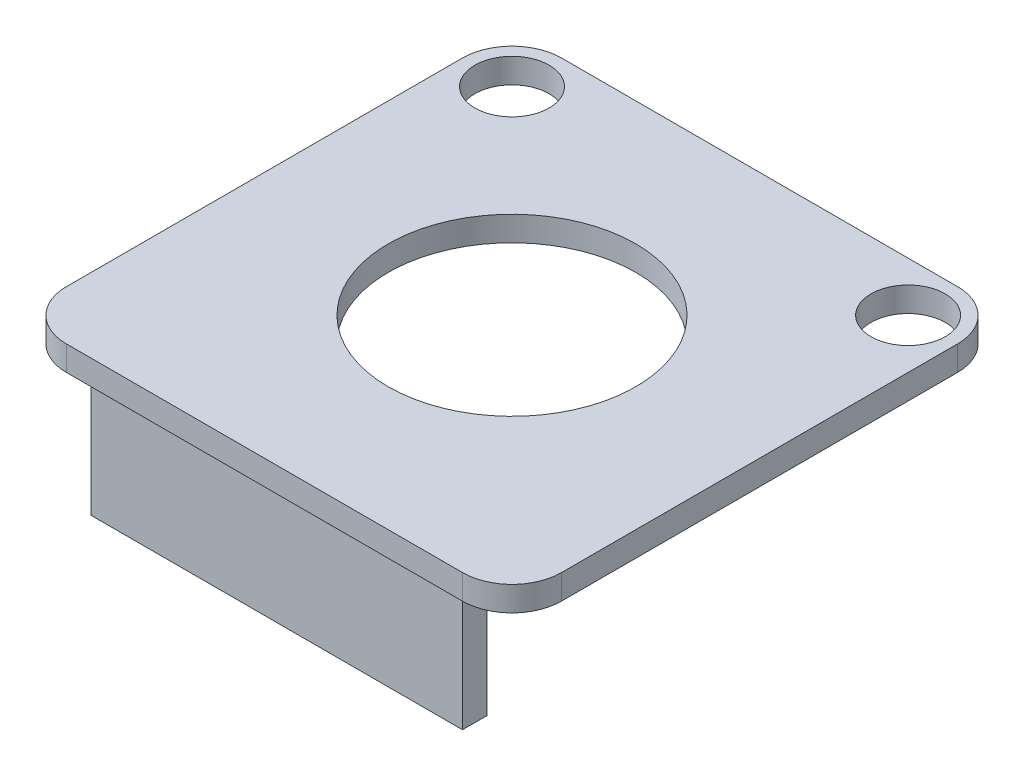
ISO-10303-21;
HEADER;
FILE_DESCRIPTION(('STEP AP214'),'2;1');
FILE_NAME('part.step','',(''),(''),'','','');
FILE_SCHEMA(('AUTOMOTIVE_DESIGN { 1 0 10303 214 1 1 1 1 }'));
ENDSEC;
DATA;
#1=APPLICATION_CONTEXT('core data for automotive mechanical design processes');
#2=APPLICATION_PROTOCOL_DEFINITION('international standard','automotive_design',2000,#1);
#3=PRODUCT_CONTEXT('',#1,'mechanical');
#4=PRODUCT('Part','Part','',(#3));
#5=PRODUCT_RELATED_PRODUCT_CATEGORY('part','',(#4));
#6=PRODUCT_DEFINITION_FORMATION('','',#4);
#7=PRODUCT_DEFINITION_CONTEXT('part definition',#1,'design');
#8=PRODUCT_DEFINITION('design','',#6,#7);
#9=PRODUCT_DEFINITION_SHAPE('','',#8);
#10=(LENGTH_UNIT() NAMED_UNIT(*) SI_UNIT(.MILLI.,.METRE.));
#11=(NAMED_UNIT(*) PLANE_ANGLE_UNIT() SI_UNIT($,.RADIAN.));
#12=(NAMED_UNIT(*) SI_UNIT($,.STERADIAN.) SOLID_ANGLE_UNIT());
#13=UNCERTAINTY_MEASURE_WITH_UNIT(LENGTH_MEASURE(1.E-05),#10,'distance_accuracy_value','');
#14=(GEOMETRIC_REPRESENTATION_CONTEXT(3) GLOBAL_UNCERTAINTY_ASSIGNED_CONTEXT((#13)) GLOBAL_UNIT_ASSIGNED_CONTEXT((#10,
#11,#12)) REPRESENTATION_CONTEXT('',''));
#15=CARTESIAN_POINT('',(0.,0.,0.));
#16=DIRECTION('',(0.,0.,1.));
#17=DIRECTION('',(1.,0.,0.));
#18=AXIS2_PLACEMENT_3D('',#15,#16,#17);
#19=CARTESIAN_POINT('',(0.,0.,0.));
#20=DIRECTION('',(0.,-1.,0.));
#21=DIRECTION('',(0.,0.,-1.));
#22=AXIS2_PLACEMENT_3D('',#19,#20,#21);
#23=PLANE('',#22);
#24=CARTESIAN_POINT('',(0.,0.,0.));
#25=DIRECTION('',(0.,1.,0.));
#26=DIRECTION('',(0.,0.,1.));
#27=AXIS2_PLACEMENT_3D('',#24,#25,#26);
#28=CIRCLE('',#27,5.);
#29=CARTESIAN_POINT('',(0.,0.,5.));
#30=VERTEX_POINT('',#29);
#31=EDGE_CURVE('E155',#30,#30,#28,.T.);
#32=ORIENTED_EDGE('',*,*,#31,.T.);
#33=EDGE_LOOP('',(#32));
#34=FACE_BOUND('',#33,.T.);
#35=CARTESIAN_POINT('',(-8.00000000000001,0.,-8.));
#36=DIRECTION('',(0.,1.,0.));
#37=DIRECTION('',(0.,0.,1.));
#38=AXIS2_PLACEMENT_3D('',#35,#36,#37);
#39=CIRCLE('',#38,1.5);
#40=CARTESIAN_POINT('',(-8.00000000000001,0.,-6.5));
#41=VERTEX_POINT('',#40);
#42=EDGE_CURVE('E162',#41,#41,#39,.T.);
#43=ORIENTED_EDGE('',*,*,#42,.T.);
#44=EDGE_LOOP('',(#43));
#45=FACE_BOUND('',#44,.T.);
#46=CARTESIAN_POINT('',(7.99999999999999,0.,-8.));
#47=DIRECTION('',(0.,1.,0.));
#48=DIRECTION('',(0.,0.,1.));
#49=AXIS2_PLACEMENT_3D('',#46,#47,#48);
#50=CIRCLE('',#49,1.5);
#51=CARTESIAN_POINT('',(7.99999999999999,0.,-6.5));
#52=VERTEX_POINT('',#51);
#53=EDGE_CURVE('E150',#52,#52,#50,.T.);
#54=ORIENTED_EDGE('',*,*,#53,.T.);
#55=EDGE_LOOP('',(#54));
#56=FACE_BOUND('',#55,.T.);
#57=DIRECTION('',(0.,0.,-1.));
#58=VECTOR('',#57,1.);
#59=CARTESIAN_POINT('',(9.99999999999999,0.,10.));
#60=LINE('',#59,#58);
#61=CARTESIAN_POINT('',(9.99999999999999,0.,8.));
#62=VERTEX_POINT('',#61);
#63=CARTESIAN_POINT('',(9.99999999999999,0.,-8.));
#64=VERTEX_POINT('',#63);
#65=EDGE_CURVE('E158',#62,#64,#60,.T.);
#66=ORIENTED_EDGE('',*,*,#65,.F.);
#67=CARTESIAN_POINT('',(7.99999999999999,0.,8.));
#68=DIRECTION('',(0.,-1.,0.));
#69=DIRECTION('',(0.,0.,-1.));
#70=AXIS2_PLACEMENT_3D('',#67,#68,#69);
#71=CIRCLE('',#70,2.);
#72=CARTESIAN_POINT('',(8.,0.,10.));
#73=VERTEX_POINT('',#72);
#74=EDGE_CURVE('E202',#62,#73,#71,.T.);
#75=ORIENTED_EDGE('',*,*,#74,.T.);
#76=DIRECTION('',(1.,0.,0.));
#77=VECTOR('',#76,1.);
#78=CARTESIAN_POINT('',(-10.,0.,10.));
#79=LINE('',#78,#77);
#80=CARTESIAN_POINT('',(-8.00000000000001,0.,10.));
#81=VERTEX_POINT('',#80);
#82=EDGE_CURVE('E174',#81,#73,#79,.T.);
#83=ORIENTED_EDGE('',*,*,#82,.F.);
#84=CARTESIAN_POINT('',(-8.00000000000001,0.,8.));
#85=DIRECTION('',(0.,-1.,0.));
#86=DIRECTION('',(0.,0.,-1.));
#87=AXIS2_PLACEMENT_3D('',#84,#85,#86);
#88=CIRCLE('',#87,2.);
#89=CARTESIAN_POINT('',(-10.,0.,8.));
#90=VERTEX_POINT('',#89);
#91=EDGE_CURVE('E198',#81,#90,#88,.T.);
#92=ORIENTED_EDGE('',*,*,#91,.T.);
#93=DIRECTION('',(0.,0.,1.));
#94=VECTOR('',#93,1.);
#95=CARTESIAN_POINT('',(-10.,0.,10.));
#96=LINE('',#95,#94);
#97=CARTESIAN_POINT('',(-10.,0.,-8.));
#98=VERTEX_POINT('',#97);
#99=EDGE_CURVE('E188',#98,#90,#96,.T.);
#100=ORIENTED_EDGE('',*,*,#99,.F.);
#101=CARTESIAN_POINT('',(-8.00000000000001,0.,-8.));
#102=DIRECTION('',(0.,-1.,0.));
#103=DIRECTION('',(0.,0.,-1.));
#104=AXIS2_PLACEMENT_3D('',#101,#102,#103);
#105=CIRCLE('',#104,2.);
#106=CARTESIAN_POINT('',(-8.00000000000001,0.,-10.));
#107=VERTEX_POINT('',#106);
#108=EDGE_CURVE('E196',#98,#107,#105,.T.);
#109=ORIENTED_EDGE('',*,*,#108,.T.);
#110=DIRECTION('',(-1.,0.,0.));
#111=VECTOR('',#110,1.);
#112=CARTESIAN_POINT('',(-10.,0.,-10.));
#113=LINE('',#112,#111);
#114=CARTESIAN_POINT('',(8.,0.,-10.));
#115=VERTEX_POINT('',#114);
#116=EDGE_CURVE('E185',#115,#107,#113,.T.);
#117=ORIENTED_EDGE('',*,*,#116,.F.);
#118=CARTESIAN_POINT('',(8.,0.,-8.));
#119=DIRECTION('',(0.,-1.,0.));
#120=DIRECTION('',(0.,0.,-1.));
#121=AXIS2_PLACEMENT_3D('',#118,#119,#120);
#122=CIRCLE('',#121,2.);
#123=EDGE_CURVE('E200',#115,#64,#122,.T.);
#124=ORIENTED_EDGE('',*,*,#123,.T.);
#125=EDGE_LOOP('',(#66,#75,#83,#92,#100,#109,#117,#124));
#126=FACE_BOUND('',#125,.T.);
#127=DIRECTION('',(-1.,0.,0.));
#128=VECTOR('',#127,1.);
#129=CARTESIAN_POINT('',(-7.5,0.,9.5));
#130=LINE('',#129,#128);
#131=CARTESIAN_POINT('',(7.5,0.,9.5));
#132=VERTEX_POINT('',#131);
#133=CARTESIAN_POINT('',(-7.5,0.,9.5));
#134=VERTEX_POINT('',#133);
#135=EDGE_CURVE('E430',#132,#134,#130,.T.);
#136=ORIENTED_EDGE('',*,*,#135,.F.);
#137=DIRECTION('',(0.,0.,1.));
#138=VECTOR('',#137,1.);
#139=CARTESIAN_POINT('',(7.5,0.,9.5));
#140=LINE('',#139,#138);
#141=CARTESIAN_POINT('',(7.5,0.,8.5));
#142=VERTEX_POINT('',#141);
#143=EDGE_CURVE('E145',#142,#132,#140,.T.);
#144=ORIENTED_EDGE('',*,*,#143,.F.);
#145=DIRECTION('',(1.,0.,0.));
#146=VECTOR('',#145,1.);
#147=CARTESIAN_POINT('',(-7.5,0.,8.5));
#148=LINE('',#147,#146);
#149=CARTESIAN_POINT('',(-7.5,0.,8.5));
#150=VERTEX_POINT('',#149);
#151=EDGE_CURVE('E141',#150,#142,#148,.T.);
#152=ORIENTED_EDGE('',*,*,#151,.F.);
#153=DIRECTION('',(0.,0.,-1.));
#154=VECTOR('',#153,1.);
#155=CARTESIAN_POINT('',(-7.5,0.,9.5));
#156=LINE('',#155,#154);
#157=EDGE_CURVE('E427',#134,#150,#156,.T.);
#158=ORIENTED_EDGE('',*,*,#157,.F.);
#159=EDGE_LOOP('',(#136,#144,#152,#158));
#160=FACE_BOUND('',#159,.T.);
#161=ADVANCED_FACE('F33',(#34,#45,#56,#126,#160),#23,.T.);
#162=CARTESIAN_POINT('',(9.99999999999999,1.,10.));
#163=DIRECTION('',(-1.,0.,0.));
#164=DIRECTION('',(0.,0.,1.));
#165=AXIS2_PLACEMENT_3D('',#162,#163,#164);
#166=PLANE('',#165);
#167=DIRECTION('',(0.,0.,-1.));
#168=VECTOR('',#167,1.);
#169=CARTESIAN_POINT('',(9.99999999999999,1.,10.));
#170=LINE('',#169,#168);
#171=CARTESIAN_POINT('',(9.99999999999999,1.,8.));
#172=VERTEX_POINT('',#171);
#173=CARTESIAN_POINT('',(9.99999999999999,1.,-8.));
#174=VERTEX_POINT('',#173);
#175=EDGE_CURVE('E170',#172,#174,#170,.T.);
#176=ORIENTED_EDGE('',*,*,#175,.F.);
#177=DIRECTION('',(0.,-1.,0.));
#178=VECTOR('',#177,1.);
#179=CARTESIAN_POINT('',(9.99999999999999,1.,8.));
#180=LINE('',#179,#178);
#181=EDGE_CURVE('E193',#172,#62,#180,.T.);
#182=ORIENTED_EDGE('',*,*,#181,.T.);
#183=ORIENTED_EDGE('',*,*,#65,.T.);
#184=DIRECTION('',(0.,-1.,0.));
#185=VECTOR('',#184,1.);
#186=CARTESIAN_POINT('',(9.99999999999999,1.,-8.));
#187=LINE('',#186,#185);
#188=EDGE_CURVE('E182',#64,#174,#187,.F.);
#189=ORIENTED_EDGE('',*,*,#188,.T.);
#190=EDGE_LOOP('',(#176,#182,#183,#189));
#191=FACE_BOUND('',#190,.T.);
#192=ADVANCED_FACE('F248',(#191),#166,.F.);
#193=CARTESIAN_POINT('',(-10.,1.,-10.));
#194=DIRECTION('',(0.,0.,1.));
#195=DIRECTION('',(1.,0.,0.));
#196=AXIS2_PLACEMENT_3D('',#193,#194,#195);
#197=PLANE('',#196);
#198=DIRECTION('',(-1.,0.,0.));
#199=VECTOR('',#198,1.);
#200=CARTESIAN_POINT('',(-10.,1.,-10.));
#201=LINE('',#200,#199);
#202=CARTESIAN_POINT('',(8.,1.,-10.));
#203=VERTEX_POINT('',#202);
#204=CARTESIAN_POINT('',(-8.00000000000001,1.,-10.));
#205=VERTEX_POINT('',#204);
#206=EDGE_CURVE('E173',#203,#205,#201,.T.);
#207=ORIENTED_EDGE('',*,*,#206,.F.);
#208=DIRECTION('',(0.,-1.,0.));
#209=VECTOR('',#208,1.);
#210=CARTESIAN_POINT('',(8.,1.,-10.));
#211=LINE('',#210,#209);
#212=EDGE_CURVE('E219',#203,#115,#211,.T.);
#213=ORIENTED_EDGE('',*,*,#212,.T.);
#214=ORIENTED_EDGE('',*,*,#116,.T.);
#215=DIRECTION('',(0.,-1.,0.));
#216=VECTOR('',#215,1.);
#217=CARTESIAN_POINT('',(-8.00000000000001,1.,-10.));
#218=LINE('',#217,#216);
#219=EDGE_CURVE('E217',#107,#205,#218,.F.);
#220=ORIENTED_EDGE('',*,*,#219,.T.);
#221=EDGE_LOOP('',(#207,#213,#214,#220));
#222=FACE_BOUND('',#221,.T.);
#223=ADVANCED_FACE('F256',(#222),#197,.F.);
#224=CARTESIAN_POINT('',(-10.,1.,10.));
#225=DIRECTION('',(1.,0.,0.));
#226=DIRECTION('',(0.,0.,-1.));
#227=AXIS2_PLACEMENT_3D('',#224,#225,#226);
#228=PLANE('',#227);
#229=ORIENTED_EDGE('',*,*,#99,.T.);
#230=DIRECTION('',(0.,-1.,0.));
#231=VECTOR('',#230,1.);
#232=CARTESIAN_POINT('',(-10.,1.,8.));
#233=LINE('',#232,#231);
#234=CARTESIAN_POINT('',(-10.,1.,8.));
#235=VERTEX_POINT('',#234);
#236=EDGE_CURVE('E11',#90,#235,#233,.F.);
#237=ORIENTED_EDGE('',*,*,#236,.T.);
#238=DIRECTION('',(0.,0.,1.));
#239=VECTOR('',#238,1.);
#240=CARTESIAN_POINT('',(-10.,1.,10.));
#241=LINE('',#240,#239);
#242=CARTESIAN_POINT('',(-10.,1.,-8.));
#243=VERTEX_POINT('',#242);
#244=EDGE_CURVE('E177',#243,#235,#241,.T.);
#245=ORIENTED_EDGE('',*,*,#244,.F.);
#246=DIRECTION('',(0.,-1.,0.));
#247=VECTOR('',#246,1.);
#248=CARTESIAN_POINT('',(-10.,1.,-8.));
#249=LINE('',#248,#247);
#250=EDGE_CURVE('E41',#243,#98,#249,.T.);
#251=ORIENTED_EDGE('',*,*,#250,.T.);
#252=EDGE_LOOP('',(#229,#237,#245,#251));
#253=FACE_BOUND('',#252,.T.);
#254=ADVANCED_FACE('F224',(#253),#228,.F.);
#255=CARTESIAN_POINT('',(-10.,1.,10.));
#256=DIRECTION('',(0.,0.,-1.));
#257=DIRECTION('',(-1.,0.,0.));
#258=AXIS2_PLACEMENT_3D('',#255,#256,#257);
#259=PLANE('',#258);
#260=ORIENTED_EDGE('',*,*,#82,.T.);
#261=DIRECTION('',(0.,-1.,0.));
#262=VECTOR('',#261,1.);
#263=CARTESIAN_POINT('',(8.,1.,10.));
#264=LINE('',#263,#262);
#265=CARTESIAN_POINT('',(8.,1.,10.));
#266=VERTEX_POINT('',#265);
#267=EDGE_CURVE('E207',#73,#266,#264,.F.);
#268=ORIENTED_EDGE('',*,*,#267,.T.);
#269=DIRECTION('',(1.,0.,0.));
#270=VECTOR('',#269,1.);
#271=CARTESIAN_POINT('',(-10.,1.,10.));
#272=LINE('',#271,#270);
#273=CARTESIAN_POINT('',(-8.00000000000001,1.,10.));
#274=VERTEX_POINT('',#273);
#275=EDGE_CURVE('E179',#274,#266,#272,.T.);
#276=ORIENTED_EDGE('',*,*,#275,.F.);
#277=DIRECTION('',(0.,-1.,0.));
#278=VECTOR('',#277,1.);
#279=CARTESIAN_POINT('',(-8.00000000000001,1.,10.));
#280=LINE('',#279,#278);
#281=EDGE_CURVE('E204',#274,#81,#280,.T.);
#282=ORIENTED_EDGE('',*,*,#281,.T.);
#283=EDGE_LOOP('',(#260,#268,#276,#282));
#284=FACE_BOUND('',#283,.T.);
#285=ADVANCED_FACE('F238',(#284),#259,.F.);
#286=CARTESIAN_POINT('',(0.,1.,0.));
#287=DIRECTION('',(0.,-1.,0.));
#288=DIRECTION('',(0.,0.,-1.));
#289=AXIS2_PLACEMENT_3D('',#286,#287,#288);
#290=PLANE('',#289);
#291=CARTESIAN_POINT('',(0.,1.,0.));
#292=DIRECTION('',(0.,1.,0.));
#293=DIRECTION('',(0.,0.,1.));
#294=AXIS2_PLACEMENT_3D('',#291,#292,#293);
#295=CIRCLE('',#294,5.);
#296=CARTESIAN_POINT('',(0.,1.,5.));
#297=VERTEX_POINT('',#296);
#298=EDGE_CURVE('E159',#297,#297,#295,.T.);
#299=ORIENTED_EDGE('',*,*,#298,.F.);
#300=EDGE_LOOP('',(#299));
#301=FACE_BOUND('',#300,.T.);
#302=CARTESIAN_POINT('',(-8.00000000000001,1.,-8.));
#303=DIRECTION('',(0.,1.,0.));
#304=DIRECTION('',(0.,0.,1.));
#305=AXIS2_PLACEMENT_3D('',#302,#303,#304);
#306=CIRCLE('',#305,1.5);
#307=CARTESIAN_POINT('',(-8.00000000000001,1.,-6.5));
#308=VERTEX_POINT('',#307);
#309=EDGE_CURVE('E165',#308,#308,#306,.T.);
#310=ORIENTED_EDGE('',*,*,#309,.F.);
#311=EDGE_LOOP('',(#310));
#312=FACE_BOUND('',#311,.T.);
#313=CARTESIAN_POINT('',(7.99999999999999,1.,-8.));
#314=DIRECTION('',(0.,1.,0.));
#315=DIRECTION('',(0.,0.,1.));
#316=AXIS2_PLACEMENT_3D('',#313,#314,#315);
#317=CIRCLE('',#316,1.5);
#318=CARTESIAN_POINT('',(7.99999999999999,1.,-6.5));
#319=VERTEX_POINT('',#318);
#320=EDGE_CURVE('E147',#319,#319,#317,.T.);
#321=ORIENTED_EDGE('',*,*,#320,.F.);
#322=EDGE_LOOP('',(#321));
#323=FACE_BOUND('',#322,.T.);
#324=ORIENTED_EDGE('',*,*,#275,.T.);
#325=CARTESIAN_POINT('',(7.99999999999999,1.,8.));
#326=DIRECTION('',(0.,-1.,0.));
#327=DIRECTION('',(0.,0.,-1.));
#328=AXIS2_PLACEMENT_3D('',#325,#326,#327);
#329=CIRCLE('',#328,2.);
#330=EDGE_CURVE('E215',#266,#172,#329,.F.);
#331=ORIENTED_EDGE('',*,*,#330,.T.);
#332=ORIENTED_EDGE('',*,*,#175,.T.);
#333=CARTESIAN_POINT('',(8.,1.,-8.));
#334=DIRECTION('',(0.,-1.,0.));
#335=DIRECTION('',(0.,0.,-1.));
#336=AXIS2_PLACEMENT_3D('',#333,#334,#335);
#337=CIRCLE('',#336,2.);
#338=EDGE_CURVE('E213',#174,#203,#337,.F.);
#339=ORIENTED_EDGE('',*,*,#338,.T.);
#340=ORIENTED_EDGE('',*,*,#206,.T.);
#341=CARTESIAN_POINT('',(-8.00000000000001,1.,-8.));
#342=DIRECTION('',(0.,-1.,0.));
#343=DIRECTION('',(0.,0.,-1.));
#344=AXIS2_PLACEMENT_3D('',#341,#342,#343);
#345=CIRCLE('',#344,2.);
#346=EDGE_CURVE('E209',#205,#243,#345,.F.);
#347=ORIENTED_EDGE('',*,*,#346,.T.);
#348=ORIENTED_EDGE('',*,*,#244,.T.);
#349=CARTESIAN_POINT('',(-8.00000000000001,1.,8.));
#350=DIRECTION('',(0.,-1.,0.));
#351=DIRECTION('',(0.,0.,-1.));
#352=AXIS2_PLACEMENT_3D('',#349,#350,#351);
#353=CIRCLE('',#352,2.);
#354=EDGE_CURVE('E211',#235,#274,#353,.F.);
#355=ORIENTED_EDGE('',*,*,#354,.T.);
#356=EDGE_LOOP('',(#324,#331,#332,#339,#340,#347,#348,#355));
#357=FACE_BOUND('',#356,.T.);
#358=ADVANCED_FACE('F242',(#301,#312,#323,#357),#290,.F.);
#359=CARTESIAN_POINT('',(7.99999999999999,0.,-8.));
#360=DIRECTION('',(0.,1.,0.));
#361=DIRECTION('',(0.,0.,1.));
#362=AXIS2_PLACEMENT_3D('',#359,#360,#361);
#363=CYLINDRICAL_SURFACE('',#362,1.5);
#364=ORIENTED_EDGE('',*,*,#53,.F.);
#365=EDGE_LOOP('',(#364));
#366=FACE_BOUND('',#365,.T.);
#367=ORIENTED_EDGE('',*,*,#320,.T.);
#368=EDGE_LOOP('',(#367));
#369=FACE_BOUND('',#368,.T.);
#370=ADVANCED_FACE('F352',(#366,#369),#363,.F.);
#371=CARTESIAN_POINT('',(-8.00000000000001,0.,-8.));
#372=DIRECTION('',(0.,1.,0.));
#373=DIRECTION('',(0.,0.,1.));
#374=AXIS2_PLACEMENT_3D('',#371,#372,#373);
#375=CYLINDRICAL_SURFACE('',#374,1.5);
#376=ORIENTED_EDGE('',*,*,#42,.F.);
#377=EDGE_LOOP('',(#376));
#378=FACE_BOUND('',#377,.T.);
#379=ORIENTED_EDGE('',*,*,#309,.T.);
#380=EDGE_LOOP('',(#379));
#381=FACE_BOUND('',#380,.T.);
#382=ADVANCED_FACE('F349',(#378,#381),#375,.F.);
#383=CARTESIAN_POINT('',(0.,0.,0.));
#384=DIRECTION('',(0.,1.,0.));
#385=DIRECTION('',(0.,0.,1.));
#386=AXIS2_PLACEMENT_3D('',#383,#384,#385);
#387=CYLINDRICAL_SURFACE('',#386,5.);
#388=ORIENTED_EDGE('',*,*,#31,.F.);
#389=EDGE_LOOP('',(#388));
#390=FACE_BOUND('',#389,.T.);
#391=ORIENTED_EDGE('',*,*,#298,.T.);
#392=EDGE_LOOP('',(#391));
#393=FACE_BOUND('',#392,.T.);
#394=ADVANCED_FACE('F283',(#390,#393),#387,.F.);
#395=CARTESIAN_POINT('',(7.99999999999999,1.,8.));
#396=DIRECTION('',(0.,-1.,0.));
#397=DIRECTION('',(0.,0.,-1.));
#398=AXIS2_PLACEMENT_3D('',#395,#396,#397);
#399=CYLINDRICAL_SURFACE('',#398,2.);
#400=ORIENTED_EDGE('',*,*,#330,.F.);
#401=ORIENTED_EDGE('',*,*,#267,.F.);
#402=ORIENTED_EDGE('',*,*,#74,.F.);
#403=ORIENTED_EDGE('',*,*,#181,.F.);
#404=EDGE_LOOP('',(#400,#401,#402,#403));
#405=FACE_BOUND('',#404,.T.);
#406=ADVANCED_FACE('F246',(#405),#399,.T.);
#407=CARTESIAN_POINT('',(8.,1.,-8.));
#408=DIRECTION('',(0.,-1.,0.));
#409=DIRECTION('',(0.,0.,-1.));
#410=AXIS2_PLACEMENT_3D('',#407,#408,#409);
#411=CYLINDRICAL_SURFACE('',#410,2.);
#412=ORIENTED_EDGE('',*,*,#338,.F.);
#413=ORIENTED_EDGE('',*,*,#188,.F.);
#414=ORIENTED_EDGE('',*,*,#123,.F.);
#415=ORIENTED_EDGE('',*,*,#212,.F.);
#416=EDGE_LOOP('',(#412,#413,#414,#415));
#417=FACE_BOUND('',#416,.T.);
#418=ADVANCED_FACE('F253',(#417),#411,.T.);
#419=CARTESIAN_POINT('',(-8.00000000000001,1.,8.));
#420=DIRECTION('',(0.,-1.,0.));
#421=DIRECTION('',(0.,0.,-1.));
#422=AXIS2_PLACEMENT_3D('',#419,#420,#421);
#423=CYLINDRICAL_SURFACE('',#422,2.);
#424=ORIENTED_EDGE('',*,*,#354,.F.);
#425=ORIENTED_EDGE('',*,*,#236,.F.);
#426=ORIENTED_EDGE('',*,*,#91,.F.);
#427=ORIENTED_EDGE('',*,*,#281,.F.);
#428=EDGE_LOOP('',(#424,#425,#426,#427));
#429=FACE_BOUND('',#428,.T.);
#430=ADVANCED_FACE('F235',(#429),#423,.T.);
#431=CARTESIAN_POINT('',(-8.00000000000001,1.,-8.));
#432=DIRECTION('',(0.,-1.,0.));
#433=DIRECTION('',(0.,0.,-1.));
#434=AXIS2_PLACEMENT_3D('',#431,#432,#433);
#435=CYLINDRICAL_SURFACE('',#434,2.);
#436=ORIENTED_EDGE('',*,*,#346,.F.);
#437=ORIENTED_EDGE('',*,*,#219,.F.);
#438=ORIENTED_EDGE('',*,*,#108,.F.);
#439=ORIENTED_EDGE('',*,*,#250,.F.);
#440=EDGE_LOOP('',(#436,#437,#438,#439));
#441=FACE_BOUND('',#440,.T.);
#442=ADVANCED_FACE('F35',(#441),#435,.T.);
#443=CARTESIAN_POINT('',(7.5,-5.,9.5));
#444=DIRECTION('',(-1.,0.,0.));
#445=DIRECTION('',(0.,0.,1.));
#446=AXIS2_PLACEMENT_3D('',#443,#444,#445);
#447=PLANE('',#446);
#448=ORIENTED_EDGE('',*,*,#143,.T.);
#449=DIRECTION('',(0.,1.,0.));
#450=VECTOR('',#449,1.);
#451=CARTESIAN_POINT('',(7.5,-5.,9.5));
#452=LINE('',#451,#450);
#453=CARTESIAN_POINT('',(7.5,-5.,9.5));
#454=VERTEX_POINT('',#453);
#455=EDGE_CURVE('E126',#454,#132,#452,.T.);
#456=ORIENTED_EDGE('',*,*,#455,.F.);
#457=DIRECTION('',(0.,0.,1.));
#458=VECTOR('',#457,1.);
#459=CARTESIAN_POINT('',(7.5,-5.,9.5));
#460=LINE('',#459,#458);
#461=CARTESIAN_POINT('',(7.5,-5.,8.5));
#462=VERTEX_POINT('',#461);
#463=EDGE_CURVE('E133',#462,#454,#460,.T.);
#464=ORIENTED_EDGE('',*,*,#463,.F.);
#465=DIRECTION('',(0.,1.,0.));
#466=VECTOR('',#465,1.);
#467=CARTESIAN_POINT('',(7.5,-5.,8.5));
#468=LINE('',#467,#466);
#469=EDGE_CURVE('E425',#462,#142,#468,.T.);
#470=ORIENTED_EDGE('',*,*,#469,.T.);
#471=EDGE_LOOP('',(#448,#456,#464,#470));
#472=FACE_BOUND('',#471,.T.);
#473=ADVANCED_FACE('F143',(#472),#447,.F.);
#474=CARTESIAN_POINT('',(-7.5,-5.,9.5));
#475=DIRECTION('',(0.,0.,-1.));
#476=DIRECTION('',(-1.,0.,0.));
#477=AXIS2_PLACEMENT_3D('',#474,#475,#476);
#478=PLANE('',#477);
#479=ORIENTED_EDGE('',*,*,#135,.T.);
#480=DIRECTION('',(0.,1.,0.));
#481=VECTOR('',#480,1.);
#482=CARTESIAN_POINT('',(-7.5,-5.,9.5));
#483=LINE('',#482,#481);
#484=CARTESIAN_POINT('',(-7.5,-5.,9.5));
#485=VERTEX_POINT('',#484);
#486=EDGE_CURVE('E129',#485,#134,#483,.T.);
#487=ORIENTED_EDGE('',*,*,#486,.F.);
#488=DIRECTION('',(-1.,0.,0.));
#489=VECTOR('',#488,1.);
#490=CARTESIAN_POINT('',(-7.5,-5.,9.5));
#491=LINE('',#490,#489);
#492=EDGE_CURVE('E122',#454,#485,#491,.T.);
#493=ORIENTED_EDGE('',*,*,#492,.F.);
#494=ORIENTED_EDGE('',*,*,#455,.T.);
#495=EDGE_LOOP('',(#479,#487,#493,#494));
#496=FACE_BOUND('',#495,.T.);
#497=ADVANCED_FACE('F124',(#496),#478,.F.);
#498=CARTESIAN_POINT('',(-7.5,-5.,9.5));
#499=DIRECTION('',(1.,0.,0.));
#500=DIRECTION('',(0.,0.,-1.));
#501=AXIS2_PLACEMENT_3D('',#498,#499,#500);
#502=PLANE('',#501);
#503=ORIENTED_EDGE('',*,*,#157,.T.);
#504=DIRECTION('',(0.,1.,0.));
#505=VECTOR('',#504,1.);
#506=CARTESIAN_POINT('',(-7.5,-5.,8.5));
#507=LINE('',#506,#505);
#508=CARTESIAN_POINT('',(-7.5,-5.,8.5));
#509=VERTEX_POINT('',#508);
#510=EDGE_CURVE('E48',#509,#150,#507,.T.);
#511=ORIENTED_EDGE('',*,*,#510,.F.);
#512=DIRECTION('',(0.,0.,-1.));
#513=VECTOR('',#512,1.);
#514=CARTESIAN_POINT('',(-7.5,-5.,9.5));
#515=LINE('',#514,#513);
#516=EDGE_CURVE('E132',#485,#509,#515,.T.);
#517=ORIENTED_EDGE('',*,*,#516,.F.);
#518=ORIENTED_EDGE('',*,*,#486,.T.);
#519=EDGE_LOOP('',(#503,#511,#517,#518));
#520=FACE_BOUND('',#519,.T.);
#521=ADVANCED_FACE('F317',(#520),#502,.F.);
#522=CARTESIAN_POINT('',(-7.5,-5.,8.5));
#523=DIRECTION('',(0.,0.,1.));
#524=DIRECTION('',(1.,0.,0.));
#525=AXIS2_PLACEMENT_3D('',#522,#523,#524);
#526=PLANE('',#525);
#527=ORIENTED_EDGE('',*,*,#151,.T.);
#528=ORIENTED_EDGE('',*,*,#469,.F.);
#529=DIRECTION('',(1.,0.,0.));
#530=VECTOR('',#529,1.);
#531=CARTESIAN_POINT('',(-7.5,-5.,8.5));
#532=LINE('',#531,#530);
#533=EDGE_CURVE('E137',#509,#462,#532,.T.);
#534=ORIENTED_EDGE('',*,*,#533,.F.);
#535=ORIENTED_EDGE('',*,*,#510,.T.);
#536=EDGE_LOOP('',(#527,#528,#534,#535));
#537=FACE_BOUND('',#536,.T.);
#538=ADVANCED_FACE('F326',(#537),#526,.F.);
#539=CARTESIAN_POINT('',(0.,-5.,0.));
#540=DIRECTION('',(0.,-1.,0.));
#541=DIRECTION('',(0.,0.,-1.));
#542=AXIS2_PLACEMENT_3D('',#539,#540,#541);
#543=PLANE('',#542);
#544=ORIENTED_EDGE('',*,*,#463,.T.);
#545=ORIENTED_EDGE('',*,*,#492,.T.);
#546=ORIENTED_EDGE('',*,*,#516,.T.);
#547=ORIENTED_EDGE('',*,*,#533,.T.);
#548=EDGE_LOOP('',(#544,#545,#546,#547));
#549=FACE_BOUND('',#548,.T.);
#550=ADVANCED_FACE('F136',(#549),#543,.T.);
#551=CLOSED_SHELL('',(#161,#192,#223,#254,#285,#358,#370,#382,#394,#406,#418,#430,#442,#473,
#497,#521,#538,#550));
#552=MANIFOLD_SOLID_BREP('B2',#551);
#553=ADVANCED_BREP_SHAPE_REPRESENTATION('',(#18,#552),#14);
#554=SHAPE_DEFINITION_REPRESENTATION(#9,#553);
ENDSEC;
END-ISO-10303-21;
